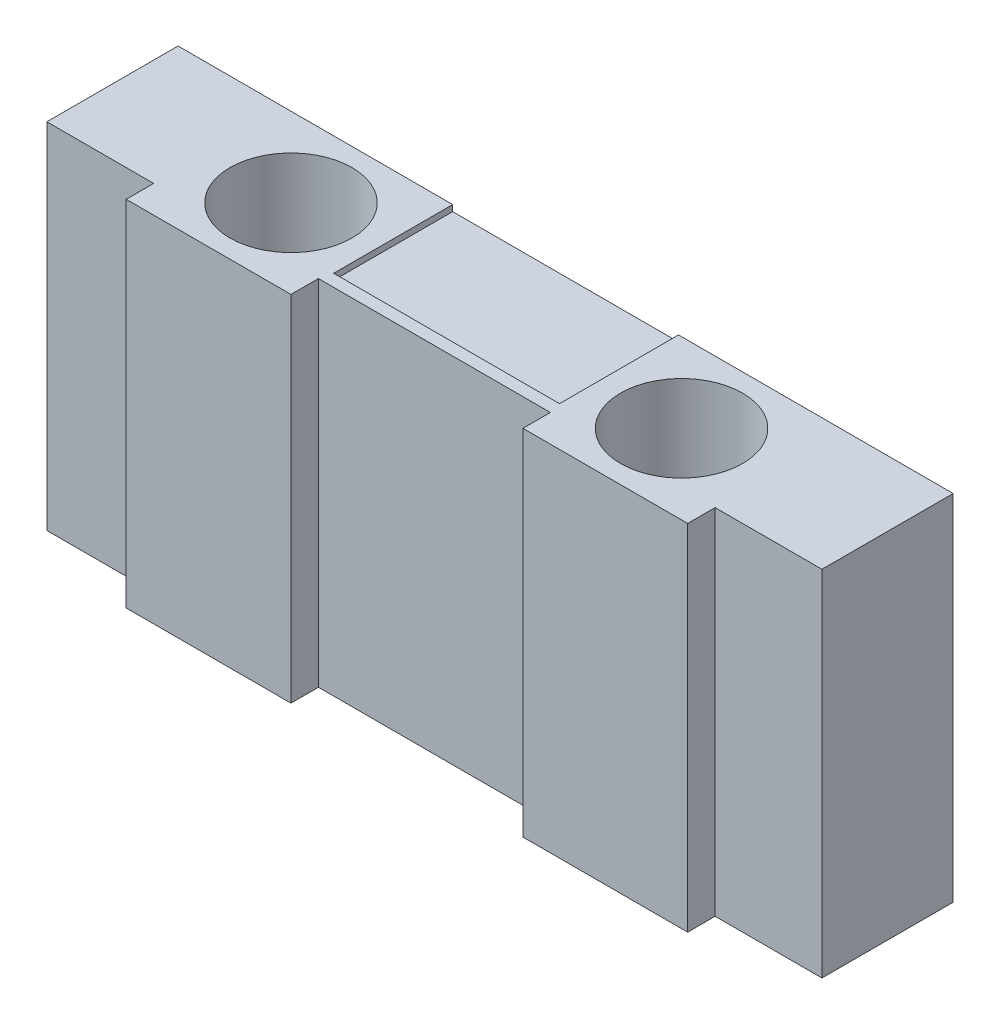
ISO-10303-21;
HEADER;
FILE_DESCRIPTION(('STEP AP214'),'2;1');
FILE_NAME('part.step','',(''),(''),'','','');
FILE_SCHEMA(('AUTOMOTIVE_DESIGN { 1 0 10303 214 1 1 1 1 }'));
ENDSEC;
DATA;
#1=APPLICATION_CONTEXT('core data for automotive mechanical design processes');
#2=APPLICATION_PROTOCOL_DEFINITION('international standard','automotive_design',2000,#1);
#3=PRODUCT_CONTEXT('',#1,'mechanical');
#4=PRODUCT('Part','Part','',(#3));
#5=PRODUCT_RELATED_PRODUCT_CATEGORY('part','',(#4));
#6=PRODUCT_DEFINITION_FORMATION('','',#4);
#7=PRODUCT_DEFINITION_CONTEXT('part definition',#1,'design');
#8=PRODUCT_DEFINITION('design','',#6,#7);
#9=PRODUCT_DEFINITION_SHAPE('','',#8);
#10=(LENGTH_UNIT() NAMED_UNIT(*) SI_UNIT(.MILLI.,.METRE.));
#11=(NAMED_UNIT(*) PLANE_ANGLE_UNIT() SI_UNIT($,.RADIAN.));
#12=(NAMED_UNIT(*) SI_UNIT($,.STERADIAN.) SOLID_ANGLE_UNIT());
#13=UNCERTAINTY_MEASURE_WITH_UNIT(LENGTH_MEASURE(1.E-05),#10,'distance_accuracy_value','');
#14=(GEOMETRIC_REPRESENTATION_CONTEXT(3) GLOBAL_UNCERTAINTY_ASSIGNED_CONTEXT((#13)) GLOBAL_UNIT_ASSIGNED_CONTEXT((#10,
#11,#12)) REPRESENTATION_CONTEXT('',''));
#15=CARTESIAN_POINT('',(0.,0.,0.));
#16=DIRECTION('',(0.,0.,1.));
#17=DIRECTION('',(1.,0.,0.));
#18=AXIS2_PLACEMENT_3D('',#15,#16,#17);
#19=CARTESIAN_POINT('',(6.35,2.9,2.6));
#20=DIRECTION('',(-1.,0.,0.));
#21=DIRECTION('',(0.,0.,1.));
#22=AXIS2_PLACEMENT_3D('',#19,#20,#21);
#23=PLANE('',#22);
#24=DIRECTION('',(0.,1.,0.));
#25=VECTOR('',#24,1.);
#26=CARTESIAN_POINT('',(6.35,2.9,2.15));
#27=LINE('',#26,#25);
#28=CARTESIAN_POINT('',(6.35,-2.9,2.15));
#29=VERTEX_POINT('',#28);
#30=CARTESIAN_POINT('',(6.35,2.9,2.15));
#31=VERTEX_POINT('',#30);
#32=EDGE_CURVE('E171',#29,#31,#27,.T.);
#33=ORIENTED_EDGE('',*,*,#32,.F.);
#34=DIRECTION('',(0.,0.,-1.));
#35=VECTOR('',#34,1.);
#36=CARTESIAN_POINT('',(6.35,-2.9,2.6));
#37=LINE('',#36,#35);
#38=CARTESIAN_POINT('',(6.35,-2.9,0.));
#39=VERTEX_POINT('',#38);
#40=EDGE_CURVE('E195',#29,#39,#37,.T.);
#41=ORIENTED_EDGE('',*,*,#40,.T.);
#42=DIRECTION('',(0.,1.,0.));
#43=VECTOR('',#42,1.);
#44=CARTESIAN_POINT('',(6.35,2.9,0.));
#45=LINE('',#44,#43);
#46=CARTESIAN_POINT('',(6.35,2.9,0.));
#47=VERTEX_POINT('',#46);
#48=EDGE_CURVE('E193',#39,#47,#45,.T.);
#49=ORIENTED_EDGE('',*,*,#48,.T.);
#50=DIRECTION('',(0.,0.,-1.));
#51=VECTOR('',#50,1.);
#52=CARTESIAN_POINT('',(6.35,2.9,2.6));
#53=LINE('',#52,#51);
#54=EDGE_CURVE('E188',#31,#47,#53,.T.);
#55=ORIENTED_EDGE('',*,*,#54,.F.);
#56=EDGE_LOOP('',(#33,#41,#49,#55));
#57=FACE_BOUND('',#56,.T.);
#58=ADVANCED_FACE('F33',(#57),#23,.F.);
#59=CARTESIAN_POINT('',(0.,0.,2.6));
#60=DIRECTION('',(0.,0.,1.));
#61=DIRECTION('',(1.,0.,0.));
#62=AXIS2_PLACEMENT_3D('',#59,#60,#61);
#63=PLANE('',#62);
#64=DIRECTION('',(0.,1.,0.));
#65=VECTOR('',#64,1.);
#66=CARTESIAN_POINT('',(-4.6,2.9,2.6));
#67=LINE('',#66,#65);
#68=CARTESIAN_POINT('',(-4.6,-2.9,2.6));
#69=VERTEX_POINT('',#68);
#70=CARTESIAN_POINT('',(-4.6,2.9,2.6));
#71=VERTEX_POINT('',#70);
#72=EDGE_CURVE('E333',#69,#71,#67,.T.);
#73=ORIENTED_EDGE('',*,*,#72,.F.);
#74=DIRECTION('',(1.,0.,0.));
#75=VECTOR('',#74,1.);
#76=CARTESIAN_POINT('',(-1.85,-2.9,2.6));
#77=LINE('',#76,#75);
#78=CARTESIAN_POINT('',(-1.9,-2.9,2.6));
#79=VERTEX_POINT('',#78);
#80=EDGE_CURVE('E295',#69,#79,#77,.T.);
#81=ORIENTED_EDGE('',*,*,#80,.T.);
#82=DIRECTION('',(0.,-1.,0.));
#83=VECTOR('',#82,1.);
#84=CARTESIAN_POINT('',(-1.9,-2.9,2.6));
#85=LINE('',#84,#83);
#86=CARTESIAN_POINT('',(-1.9,2.9,2.6));
#87=VERTEX_POINT('',#86);
#88=EDGE_CURVE('E315',#87,#79,#85,.T.);
#89=ORIENTED_EDGE('',*,*,#88,.F.);
#90=DIRECTION('',(-1.,0.,0.));
#91=VECTOR('',#90,1.);
#92=CARTESIAN_POINT('',(6.35,2.9,2.6));
#93=LINE('',#92,#91);
#94=EDGE_CURVE('E294',#87,#71,#93,.T.);
#95=ORIENTED_EDGE('',*,*,#94,.T.);
#96=EDGE_LOOP('',(#73,#81,#89,#95));
#97=FACE_BOUND('',#96,.T.);
#98=ADVANCED_FACE('F376',(#97),#63,.T.);
#99=CARTESIAN_POINT('',(-1.85,-2.9,2.6));
#100=DIRECTION('',(-1.,0.,0.));
#101=DIRECTION('',(0.,0.,1.));
#102=AXIS2_PLACEMENT_3D('',#99,#100,#101);
#103=PLANE('',#102);
#104=DIRECTION('',(0.,0.,-1.));
#105=VECTOR('',#104,1.);
#106=CARTESIAN_POINT('',(-1.85,-2.8,2.6));
#107=LINE('',#106,#105);
#108=CARTESIAN_POINT('',(-1.85,-2.8,1.85));
#109=VERTEX_POINT('',#108);
#110=CARTESIAN_POINT('',(-1.85,-2.8,0.));
#111=VERTEX_POINT('',#110);
#112=EDGE_CURVE('E207',#109,#111,#107,.T.);
#113=ORIENTED_EDGE('',*,*,#112,.F.);
#114=DIRECTION('',(0.,-0.707106781186544,0.707106781186552));
#115=VECTOR('',#114,1.);
#116=CARTESIAN_POINT('',(-1.85,-3.225,2.27500000000001));
#117=LINE('',#116,#115);
#118=CARTESIAN_POINT('',(-1.85,-2.9,1.95));
#119=VERTEX_POINT('',#118);
#120=EDGE_CURVE('E232',#109,#119,#117,.T.);
#121=ORIENTED_EDGE('',*,*,#120,.T.);
#122=DIRECTION('',(0.,0.,-1.));
#123=VECTOR('',#122,1.);
#124=CARTESIAN_POINT('',(-1.85,-2.9,2.6));
#125=LINE('',#124,#123);
#126=CARTESIAN_POINT('',(-1.85,-2.9,0.));
#127=VERTEX_POINT('',#126);
#128=EDGE_CURVE('E209',#119,#127,#125,.T.);
#129=ORIENTED_EDGE('',*,*,#128,.T.);
#130=DIRECTION('',(0.,1.,0.));
#131=VECTOR('',#130,1.);
#132=CARTESIAN_POINT('',(-1.85,-2.9,0.));
#133=LINE('',#132,#131);
#134=EDGE_CURVE('E287',#127,#111,#133,.T.);
#135=ORIENTED_EDGE('',*,*,#134,.T.);
#136=EDGE_LOOP('',(#113,#121,#129,#135));
#137=FACE_BOUND('',#136,.T.);
#138=ADVANCED_FACE('F407',(#137),#103,.F.);
#139=CARTESIAN_POINT('',(-1.85,-2.8,2.6));
#140=DIRECTION('',(0.,1.,0.));
#141=DIRECTION('',(0.,0.,1.));
#142=AXIS2_PLACEMENT_3D('',#139,#140,#141);
#143=PLANE('',#142);
#144=DIRECTION('',(0.,0.,-1.));
#145=VECTOR('',#144,1.);
#146=CARTESIAN_POINT('',(1.85,-2.8,2.6));
#147=LINE('',#146,#145);
#148=CARTESIAN_POINT('',(1.85,-2.8,1.85));
#149=VERTEX_POINT('',#148);
#150=CARTESIAN_POINT('',(1.85,-2.8,0.));
#151=VERTEX_POINT('',#150);
#152=EDGE_CURVE('E205',#149,#151,#147,.T.);
#153=ORIENTED_EDGE('',*,*,#152,.F.);
#154=DIRECTION('',(-1.,0.,0.));
#155=VECTOR('',#154,1.);
#156=CARTESIAN_POINT('',(-1.85,-2.8,1.85));
#157=LINE('',#156,#155);
#158=EDGE_CURVE('E229',#149,#109,#157,.T.);
#159=ORIENTED_EDGE('',*,*,#158,.T.);
#160=ORIENTED_EDGE('',*,*,#112,.T.);
#161=DIRECTION('',(1.,0.,0.));
#162=VECTOR('',#161,1.);
#163=CARTESIAN_POINT('',(-1.85,-2.8,0.));
#164=LINE('',#163,#162);
#165=EDGE_CURVE('E284',#111,#151,#164,.T.);
#166=ORIENTED_EDGE('',*,*,#165,.T.);
#167=EDGE_LOOP('',(#153,#159,#160,#166));
#168=FACE_BOUND('',#167,.T.);
#169=ADVANCED_FACE('F418',(#168),#143,.F.);
#170=CARTESIAN_POINT('',(1.85,-2.9,2.6));
#171=DIRECTION('',(1.,0.,0.));
#172=DIRECTION('',(0.,0.,-1.));
#173=AXIS2_PLACEMENT_3D('',#170,#171,#172);
#174=PLANE('',#173);
#175=DIRECTION('',(0.,0.,-1.));
#176=VECTOR('',#175,1.);
#177=CARTESIAN_POINT('',(1.85,-2.9,2.6));
#178=LINE('',#177,#176);
#179=CARTESIAN_POINT('',(1.85,-2.9,1.95));
#180=VERTEX_POINT('',#179);
#181=CARTESIAN_POINT('',(1.85,-2.9,0.));
#182=VERTEX_POINT('',#181);
#183=EDGE_CURVE('E198',#180,#182,#178,.T.);
#184=ORIENTED_EDGE('',*,*,#183,.F.);
#185=DIRECTION('',(0.,0.707106781186544,-0.707106781186552));
#186=VECTOR('',#185,1.);
#187=CARTESIAN_POINT('',(1.85,-3.225,2.27500000000001));
#188=LINE('',#187,#186);
#189=EDGE_CURVE('E226',#180,#149,#188,.T.);
#190=ORIENTED_EDGE('',*,*,#189,.T.);
#191=ORIENTED_EDGE('',*,*,#152,.T.);
#192=DIRECTION('',(0.,-1.,0.));
#193=VECTOR('',#192,1.);
#194=CARTESIAN_POINT('',(1.85,-2.9,0.));
#195=LINE('',#194,#193);
#196=EDGE_CURVE('E281',#151,#182,#195,.T.);
#197=ORIENTED_EDGE('',*,*,#196,.T.);
#198=EDGE_LOOP('',(#184,#190,#191,#197));
#199=FACE_BOUND('',#198,.T.);
#200=ADVANCED_FACE('F414',(#199),#174,.F.);
#201=CARTESIAN_POINT('',(6.35,-2.9,2.6));
#202=DIRECTION('',(0.,1.,0.));
#203=DIRECTION('',(0.,0.,1.));
#204=AXIS2_PLACEMENT_3D('',#201,#202,#203);
#205=PLANE('',#204);
#206=CARTESIAN_POINT('',(3.2,-2.9,1.3));
#207=DIRECTION('',(0.,1.,0.));
#208=DIRECTION('',(0.,0.,1.));
#209=AXIS2_PLACEMENT_3D('',#206,#207,#208);
#210=CIRCLE('',#209,1.);
#211=CARTESIAN_POINT('',(3.2,-2.9,2.3));
#212=VERTEX_POINT('',#211);
#213=EDGE_CURVE('E216',#212,#212,#210,.T.);
#214=ORIENTED_EDGE('',*,*,#213,.T.);
#215=EDGE_LOOP('',(#214));
#216=FACE_BOUND('',#215,.T.);
#217=DIRECTION('',(1.,0.,0.));
#218=VECTOR('',#217,1.);
#219=CARTESIAN_POINT('',(4.6,-2.9,2.15));
#220=LINE('',#219,#218);
#221=CARTESIAN_POINT('',(4.6,-2.9,2.15));
#222=VERTEX_POINT('',#221);
#223=EDGE_CURVE('E177',#222,#29,#220,.T.);
#224=ORIENTED_EDGE('',*,*,#223,.F.);
#225=DIRECTION('',(0.,0.,1.));
#226=VECTOR('',#225,1.);
#227=CARTESIAN_POINT('',(4.6,-2.9,2.15));
#228=LINE('',#227,#226);
#229=CARTESIAN_POINT('',(4.6,-2.9,2.6));
#230=VERTEX_POINT('',#229);
#231=EDGE_CURVE('E336',#222,#230,#228,.T.);
#232=ORIENTED_EDGE('',*,*,#231,.T.);
#233=CARTESIAN_POINT('',(1.9,-2.9,2.6));
#234=VERTEX_POINT('',#233);
#235=EDGE_CURVE('E265',#234,#230,#77,.T.);
#236=ORIENTED_EDGE('',*,*,#235,.F.);
#237=DIRECTION('',(0.,0.,1.));
#238=VECTOR('',#237,1.);
#239=CARTESIAN_POINT('',(1.9,-2.9,2.15));
#240=LINE('',#239,#238);
#241=CARTESIAN_POINT('',(1.9,-2.9,2.15));
#242=VERTEX_POINT('',#241);
#243=EDGE_CURVE('E304',#242,#234,#240,.T.);
#244=ORIENTED_EDGE('',*,*,#243,.F.);
#245=DIRECTION('',(1.,0.,0.));
#246=VECTOR('',#245,1.);
#247=CARTESIAN_POINT('',(1.9,-2.9,2.15));
#248=LINE('',#247,#246);
#249=CARTESIAN_POINT('',(-1.9,-2.9,2.15));
#250=VERTEX_POINT('',#249);
#251=EDGE_CURVE('E324',#250,#242,#248,.T.);
#252=ORIENTED_EDGE('',*,*,#251,.F.);
#253=DIRECTION('',(0.,0.,1.));
#254=VECTOR('',#253,1.);
#255=CARTESIAN_POINT('',(-1.9,-2.9,2.15));
#256=LINE('',#255,#254);
#257=EDGE_CURVE('E301',#250,#79,#256,.T.);
#258=ORIENTED_EDGE('',*,*,#257,.T.);
#259=ORIENTED_EDGE('',*,*,#80,.F.);
#260=DIRECTION('',(0.,0.,1.));
#261=VECTOR('',#260,1.);
#262=CARTESIAN_POINT('',(-4.6,-2.9,2.15));
#263=LINE('',#262,#261);
#264=CARTESIAN_POINT('',(-4.6,-2.9,2.15));
#265=VERTEX_POINT('',#264);
#266=EDGE_CURVE('E329',#265,#69,#263,.T.);
#267=ORIENTED_EDGE('',*,*,#266,.F.);
#268=DIRECTION('',(1.,0.,0.));
#269=VECTOR('',#268,1.);
#270=CARTESIAN_POINT('',(-4.6,-2.9,2.15));
#271=LINE('',#270,#269);
#272=CARTESIAN_POINT('',(-6.35,-2.9,2.15));
#273=VERTEX_POINT('',#272);
#274=EDGE_CURVE('E340',#273,#265,#271,.T.);
#275=ORIENTED_EDGE('',*,*,#274,.F.);
#276=DIRECTION('',(0.,0.,-1.));
#277=VECTOR('',#276,1.);
#278=CARTESIAN_POINT('',(-6.35,-2.9,2.6));
#279=LINE('',#278,#277);
#280=CARTESIAN_POINT('',(-6.35,-2.9,0.));
#281=VERTEX_POINT('',#280);
#282=EDGE_CURVE('E259',#273,#281,#279,.T.);
#283=ORIENTED_EDGE('',*,*,#282,.T.);
#284=DIRECTION('',(1.,0.,0.));
#285=VECTOR('',#284,1.);
#286=CARTESIAN_POINT('',(-1.85,-2.9,0.));
#287=LINE('',#286,#285);
#288=EDGE_CURVE('E290',#281,#127,#287,.T.);
#289=ORIENTED_EDGE('',*,*,#288,.T.);
#290=ORIENTED_EDGE('',*,*,#128,.F.);
#291=DIRECTION('',(1.,0.,0.));
#292=VECTOR('',#291,1.);
#293=CARTESIAN_POINT('',(1.85,-2.9,1.95));
#294=LINE('',#293,#292);
#295=EDGE_CURVE('E211',#119,#180,#294,.T.);
#296=ORIENTED_EDGE('',*,*,#295,.T.);
#297=ORIENTED_EDGE('',*,*,#183,.T.);
#298=DIRECTION('',(1.,0.,0.));
#299=VECTOR('',#298,1.);
#300=CARTESIAN_POINT('',(6.35,-2.9,0.));
#301=LINE('',#300,#299);
#302=EDGE_CURVE('E278',#182,#39,#301,.T.);
#303=ORIENTED_EDGE('',*,*,#302,.T.);
#304=ORIENTED_EDGE('',*,*,#40,.F.);
#305=EDGE_LOOP('',(#224,#232,#236,#244,#252,#258,#259,#267,#275,#283,#289,#290,#296,#297,#303,#304));
#306=FACE_BOUND('',#305,.T.);
#307=CARTESIAN_POINT('',(-3.2,-2.9,1.3));
#308=DIRECTION('',(0.,1.,0.));
#309=DIRECTION('',(0.,0.,1.));
#310=AXIS2_PLACEMENT_3D('',#307,#308,#309);
#311=CIRCLE('',#310,1.);
#312=CARTESIAN_POINT('',(-3.2,-2.9,2.3));
#313=VERTEX_POINT('',#312);
#314=EDGE_CURVE('E215',#313,#313,#311,.T.);
#315=ORIENTED_EDGE('',*,*,#314,.T.);
#316=EDGE_LOOP('',(#315));
#317=FACE_BOUND('',#316,.T.);
#318=ADVANCED_FACE('F350',(#216,#306,#317),#205,.F.);
#319=CARTESIAN_POINT('',(1.85,2.8,2.6));
#320=DIRECTION('',(1.,0.,0.));
#321=DIRECTION('',(0.,0.,-1.));
#322=AXIS2_PLACEMENT_3D('',#319,#320,#321);
#323=PLANE('',#322);
#324=DIRECTION('',(0.,0.,-1.));
#325=VECTOR('',#324,1.);
#326=CARTESIAN_POINT('',(1.85,2.8,2.6));
#327=LINE('',#326,#325);
#328=CARTESIAN_POINT('',(1.85,2.8,1.85));
#329=VERTEX_POINT('',#328);
#330=CARTESIAN_POINT('',(1.85,2.8,0.));
#331=VERTEX_POINT('',#330);
#332=EDGE_CURVE('E200',#329,#331,#327,.T.);
#333=ORIENTED_EDGE('',*,*,#332,.F.);
#334=DIRECTION('',(0.,0.707106781186544,0.707106781186552));
#335=VECTOR('',#334,1.);
#336=CARTESIAN_POINT('',(1.85,3.175,2.22500000000001));
#337=LINE('',#336,#335);
#338=CARTESIAN_POINT('',(1.85,2.9,1.95));
#339=VERTEX_POINT('',#338);
#340=EDGE_CURVE('E11',#329,#339,#337,.T.);
#341=ORIENTED_EDGE('',*,*,#340,.T.);
#342=DIRECTION('',(0.,0.,-1.));
#343=VECTOR('',#342,1.);
#344=CARTESIAN_POINT('',(1.85,2.9,2.6));
#345=LINE('',#344,#343);
#346=CARTESIAN_POINT('',(1.85,2.9,0.));
#347=VERTEX_POINT('',#346);
#348=EDGE_CURVE('E196',#339,#347,#345,.T.);
#349=ORIENTED_EDGE('',*,*,#348,.T.);
#350=DIRECTION('',(0.,-1.,0.));
#351=VECTOR('',#350,1.);
#352=CARTESIAN_POINT('',(1.85,2.8,0.));
#353=LINE('',#352,#351);
#354=EDGE_CURVE('E251',#347,#331,#353,.T.);
#355=ORIENTED_EDGE('',*,*,#354,.T.);
#356=EDGE_LOOP('',(#333,#341,#349,#355));
#357=FACE_BOUND('',#356,.T.);
#358=ADVANCED_FACE('F249',(#357),#323,.F.);
#359=CARTESIAN_POINT('',(-1.85,2.8,2.6));
#360=DIRECTION('',(0.,-1.,0.));
#361=DIRECTION('',(0.,0.,-1.));
#362=AXIS2_PLACEMENT_3D('',#359,#360,#361);
#363=PLANE('',#362);
#364=DIRECTION('',(0.,0.,-1.));
#365=VECTOR('',#364,1.);
#366=CARTESIAN_POINT('',(-1.85,2.8,2.6));
#367=LINE('',#366,#365);
#368=CARTESIAN_POINT('',(-1.85,2.8,1.85));
#369=VERTEX_POINT('',#368);
#370=CARTESIAN_POINT('',(-1.85,2.8,0.));
#371=VERTEX_POINT('',#370);
#372=EDGE_CURVE('E244',#369,#371,#367,.T.);
#373=ORIENTED_EDGE('',*,*,#372,.F.);
#374=DIRECTION('',(1.,0.,0.));
#375=VECTOR('',#374,1.);
#376=CARTESIAN_POINT('',(-1.85,2.8,1.85));
#377=LINE('',#376,#375);
#378=EDGE_CURVE('E41',#369,#329,#377,.T.);
#379=ORIENTED_EDGE('',*,*,#378,.T.);
#380=ORIENTED_EDGE('',*,*,#332,.T.);
#381=DIRECTION('',(-1.,0.,0.));
#382=VECTOR('',#381,1.);
#383=CARTESIAN_POINT('',(-1.85,2.8,0.));
#384=LINE('',#383,#382);
#385=EDGE_CURVE('E272',#331,#371,#384,.T.);
#386=ORIENTED_EDGE('',*,*,#385,.T.);
#387=EDGE_LOOP('',(#373,#379,#380,#386));
#388=FACE_BOUND('',#387,.T.);
#389=ADVANCED_FACE('F241',(#388),#363,.F.);
#390=CARTESIAN_POINT('',(-1.85,2.8,2.6));
#391=DIRECTION('',(-1.,0.,0.));
#392=DIRECTION('',(0.,0.,1.));
#393=AXIS2_PLACEMENT_3D('',#390,#391,#392);
#394=PLANE('',#393);
#395=DIRECTION('',(0.,0.,-1.));
#396=VECTOR('',#395,1.);
#397=CARTESIAN_POINT('',(-1.85,2.9,2.6));
#398=LINE('',#397,#396);
#399=CARTESIAN_POINT('',(-1.85,2.9,1.95));
#400=VERTEX_POINT('',#399);
#401=CARTESIAN_POINT('',(-1.85,2.9,0.));
#402=VERTEX_POINT('',#401);
#403=EDGE_CURVE('E253',#400,#402,#398,.T.);
#404=ORIENTED_EDGE('',*,*,#403,.F.);
#405=DIRECTION('',(0.,-0.707106781186544,-0.707106781186552));
#406=VECTOR('',#405,1.);
#407=CARTESIAN_POINT('',(-1.85,3.175,2.22500000000001));
#408=LINE('',#407,#406);
#409=EDGE_CURVE('E235',#400,#369,#408,.T.);
#410=ORIENTED_EDGE('',*,*,#409,.T.);
#411=ORIENTED_EDGE('',*,*,#372,.T.);
#412=DIRECTION('',(0.,1.,0.));
#413=VECTOR('',#412,1.);
#414=CARTESIAN_POINT('',(-1.85,2.8,0.));
#415=LINE('',#414,#413);
#416=EDGE_CURVE('E269',#371,#402,#415,.T.);
#417=ORIENTED_EDGE('',*,*,#416,.T.);
#418=EDGE_LOOP('',(#404,#410,#411,#417));
#419=FACE_BOUND('',#418,.T.);
#420=ADVANCED_FACE('F364',(#419),#394,.F.);
#421=CARTESIAN_POINT('',(-1.85,2.9,2.6));
#422=DIRECTION('',(0.,-1.,0.));
#423=DIRECTION('',(0.,0.,-1.));
#424=AXIS2_PLACEMENT_3D('',#421,#422,#423);
#425=PLANE('',#424);
#426=CARTESIAN_POINT('',(4.6,2.9,2.6));
#427=VERTEX_POINT('',#426);
#428=CARTESIAN_POINT('',(1.9,2.9,2.6));
#429=VERTEX_POINT('',#428);
#430=EDGE_CURVE('E261',#427,#429,#93,.T.);
#431=ORIENTED_EDGE('',*,*,#430,.F.);
#432=DIRECTION('',(0.,0.,1.));
#433=VECTOR('',#432,1.);
#434=CARTESIAN_POINT('',(4.6,2.9,2.15));
#435=LINE('',#434,#433);
#436=CARTESIAN_POINT('',(4.6,2.9,2.15));
#437=VERTEX_POINT('',#436);
#438=EDGE_CURVE('E48',#437,#427,#435,.T.);
#439=ORIENTED_EDGE('',*,*,#438,.F.);
#440=DIRECTION('',(-1.,0.,0.));
#441=VECTOR('',#440,1.);
#442=CARTESIAN_POINT('',(4.6,2.9,2.15));
#443=LINE('',#442,#441);
#444=EDGE_CURVE('E175',#31,#437,#443,.T.);
#445=ORIENTED_EDGE('',*,*,#444,.F.);
#446=ORIENTED_EDGE('',*,*,#54,.T.);
#447=DIRECTION('',(-1.,0.,0.));
#448=VECTOR('',#447,1.);
#449=CARTESIAN_POINT('',(6.35,2.9,0.));
#450=LINE('',#449,#448);
#451=EDGE_CURVE('E275',#47,#347,#450,.T.);
#452=ORIENTED_EDGE('',*,*,#451,.T.);
#453=ORIENTED_EDGE('',*,*,#348,.F.);
#454=DIRECTION('',(-1.,0.,0.));
#455=VECTOR('',#454,1.);
#456=CARTESIAN_POINT('',(-1.85,2.9,1.95));
#457=LINE('',#456,#455);
#458=EDGE_CURVE('E223',#339,#400,#457,.T.);
#459=ORIENTED_EDGE('',*,*,#458,.T.);
#460=ORIENTED_EDGE('',*,*,#403,.T.);
#461=DIRECTION('',(-1.,0.,0.));
#462=VECTOR('',#461,1.);
#463=CARTESIAN_POINT('',(-1.85,2.9,0.));
#464=LINE('',#463,#462);
#465=CARTESIAN_POINT('',(-6.35,2.9,0.));
#466=VERTEX_POINT('',#465);
#467=EDGE_CURVE('E266',#402,#466,#464,.T.);
#468=ORIENTED_EDGE('',*,*,#467,.T.);
#469=DIRECTION('',(0.,0.,-1.));
#470=VECTOR('',#469,1.);
#471=CARTESIAN_POINT('',(-6.35,2.9,2.6));
#472=LINE('',#471,#470);
#473=CARTESIAN_POINT('',(-6.35,2.9,2.15));
#474=VERTEX_POINT('',#473);
#475=EDGE_CURVE('E257',#474,#466,#472,.T.);
#476=ORIENTED_EDGE('',*,*,#475,.F.);
#477=DIRECTION('',(-1.,0.,0.));
#478=VECTOR('',#477,1.);
#479=CARTESIAN_POINT('',(-4.6,2.9,2.15));
#480=LINE('',#479,#478);
#481=CARTESIAN_POINT('',(-4.6,2.9,2.15));
#482=VERTEX_POINT('',#481);
#483=EDGE_CURVE('E56',#482,#474,#480,.T.);
#484=ORIENTED_EDGE('',*,*,#483,.F.);
#485=DIRECTION('',(0.,0.,1.));
#486=VECTOR('',#485,1.);
#487=CARTESIAN_POINT('',(-4.6,2.9,2.15));
#488=LINE('',#487,#486);
#489=EDGE_CURVE('E318',#482,#71,#488,.T.);
#490=ORIENTED_EDGE('',*,*,#489,.T.);
#491=ORIENTED_EDGE('',*,*,#94,.F.);
#492=DIRECTION('',(0.,0.,1.));
#493=VECTOR('',#492,1.);
#494=CARTESIAN_POINT('',(-1.9,2.9,2.15));
#495=LINE('',#494,#493);
#496=CARTESIAN_POINT('',(-1.9,2.9,2.15));
#497=VERTEX_POINT('',#496);
#498=EDGE_CURVE('E220',#497,#87,#495,.T.);
#499=ORIENTED_EDGE('',*,*,#498,.F.);
#500=DIRECTION('',(-1.,0.,0.));
#501=VECTOR('',#500,1.);
#502=CARTESIAN_POINT('',(1.9,2.9,2.15));
#503=LINE('',#502,#501);
#504=CARTESIAN_POINT('',(1.9,2.9,2.15));
#505=VERTEX_POINT('',#504);
#506=EDGE_CURVE('E305',#505,#497,#503,.T.);
#507=ORIENTED_EDGE('',*,*,#506,.F.);
#508=DIRECTION('',(0.,0.,1.));
#509=VECTOR('',#508,1.);
#510=CARTESIAN_POINT('',(1.9,2.9,2.15));
#511=LINE('',#510,#509);
#512=EDGE_CURVE('E307',#505,#429,#511,.T.);
#513=ORIENTED_EDGE('',*,*,#512,.T.);
#514=EDGE_LOOP('',(#431,#439,#445,#446,#452,#453,#459,#460,#468,#476,#484,#490,#491,#499,#507,#513));
#515=FACE_BOUND('',#514,.T.);
#516=CARTESIAN_POINT('',(-3.2,2.9,1.3));
#517=DIRECTION('',(0.,-1.,0.));
#518=DIRECTION('',(0.,0.,-1.));
#519=AXIS2_PLACEMENT_3D('',#516,#517,#518);
#520=CIRCLE('',#519,1.);
#521=CARTESIAN_POINT('',(-3.2,2.9,0.3));
#522=VERTEX_POINT('',#521);
#523=EDGE_CURVE('E212',#522,#522,#520,.T.);
#524=ORIENTED_EDGE('',*,*,#523,.T.);
#525=EDGE_LOOP('',(#524));
#526=FACE_BOUND('',#525,.T.);
#527=CARTESIAN_POINT('',(3.2,2.9,1.3));
#528=DIRECTION('',(0.,-1.,0.));
#529=DIRECTION('',(0.,0.,-1.));
#530=AXIS2_PLACEMENT_3D('',#527,#528,#529);
#531=CIRCLE('',#530,1.);
#532=CARTESIAN_POINT('',(3.2,2.9,0.300000000000001));
#533=VERTEX_POINT('',#532);
#534=EDGE_CURVE('E217',#533,#533,#531,.T.);
#535=ORIENTED_EDGE('',*,*,#534,.T.);
#536=EDGE_LOOP('',(#535));
#537=FACE_BOUND('',#536,.T.);
#538=ADVANCED_FACE('F185',(#515,#526,#537),#425,.F.);
#539=CARTESIAN_POINT('',(-6.35,2.9,2.6));
#540=DIRECTION('',(1.,0.,0.));
#541=DIRECTION('',(0.,0.,-1.));
#542=AXIS2_PLACEMENT_3D('',#539,#540,#541);
#543=PLANE('',#542);
#544=ORIENTED_EDGE('',*,*,#282,.F.);
#545=DIRECTION('',(0.,-1.,0.));
#546=VECTOR('',#545,1.);
#547=CARTESIAN_POINT('',(-6.35,2.9,2.15));
#548=LINE('',#547,#546);
#549=EDGE_CURVE('E335',#474,#273,#548,.T.);
#550=ORIENTED_EDGE('',*,*,#549,.F.);
#551=ORIENTED_EDGE('',*,*,#475,.T.);
#552=DIRECTION('',(0.,-1.,0.));
#553=VECTOR('',#552,1.);
#554=CARTESIAN_POINT('',(-6.35,2.9,0.));
#555=LINE('',#554,#553);
#556=EDGE_CURVE('E262',#466,#281,#555,.T.);
#557=ORIENTED_EDGE('',*,*,#556,.T.);
#558=EDGE_LOOP('',(#544,#550,#551,#557));
#559=FACE_BOUND('',#558,.T.);
#560=ADVANCED_FACE('F368',(#559),#543,.F.);
#561=DIRECTION('',(0.,-1.,0.));
#562=VECTOR('',#561,1.);
#563=CARTESIAN_POINT('',(4.6,2.9,2.6));
#564=LINE('',#563,#562);
#565=EDGE_CURVE('E181',#427,#230,#564,.T.);
#566=ORIENTED_EDGE('',*,*,#565,.F.);
#567=ORIENTED_EDGE('',*,*,#430,.T.);
#568=DIRECTION('',(0.,1.,0.));
#569=VECTOR('',#568,1.);
#570=CARTESIAN_POINT('',(1.9,-2.9,2.6));
#571=LINE('',#570,#569);
#572=EDGE_CURVE('E311',#234,#429,#571,.T.);
#573=ORIENTED_EDGE('',*,*,#572,.F.);
#574=ORIENTED_EDGE('',*,*,#235,.T.);
#575=EDGE_LOOP('',(#566,#567,#573,#574));
#576=FACE_BOUND('',#575,.T.);
#577=ADVANCED_FACE('F390',(#576),#63,.T.);
#578=CARTESIAN_POINT('',(0.,0.,0.));
#579=DIRECTION('',(0.,0.,1.));
#580=DIRECTION('',(1.,0.,0.));
#581=AXIS2_PLACEMENT_3D('',#578,#579,#580);
#582=PLANE('',#581);
#583=ORIENTED_EDGE('',*,*,#288,.F.);
#584=ORIENTED_EDGE('',*,*,#556,.F.);
#585=ORIENTED_EDGE('',*,*,#467,.F.);
#586=ORIENTED_EDGE('',*,*,#416,.F.);
#587=ORIENTED_EDGE('',*,*,#385,.F.);
#588=ORIENTED_EDGE('',*,*,#354,.F.);
#589=ORIENTED_EDGE('',*,*,#451,.F.);
#590=ORIENTED_EDGE('',*,*,#48,.F.);
#591=ORIENTED_EDGE('',*,*,#302,.F.);
#592=ORIENTED_EDGE('',*,*,#196,.F.);
#593=ORIENTED_EDGE('',*,*,#165,.F.);
#594=ORIENTED_EDGE('',*,*,#134,.F.);
#595=EDGE_LOOP('',(#583,#584,#585,#586,#587,#588,#589,#590,#591,#592,#593,#594));
#596=FACE_BOUND('',#595,.T.);
#597=ADVANCED_FACE('F358',(#596),#582,.F.);
#598=CARTESIAN_POINT('',(-3.2,-3.,1.3));
#599=DIRECTION('',(0.,1.,0.));
#600=DIRECTION('',(0.,0.,1.));
#601=AXIS2_PLACEMENT_3D('',#598,#599,#600);
#602=CYLINDRICAL_SURFACE('',#601,1.);
#603=ORIENTED_EDGE('',*,*,#523,.F.);
#604=EDGE_LOOP('',(#603));
#605=FACE_BOUND('',#604,.T.);
#606=ORIENTED_EDGE('',*,*,#314,.F.);
#607=EDGE_LOOP('',(#606));
#608=FACE_BOUND('',#607,.T.);
#609=ADVANCED_FACE('F433',(#605,#608),#602,.F.);
#610=CARTESIAN_POINT('',(3.2,-3.,1.3));
#611=DIRECTION('',(0.,1.,0.));
#612=DIRECTION('',(0.,0.,1.));
#613=AXIS2_PLACEMENT_3D('',#610,#611,#612);
#614=CYLINDRICAL_SURFACE('',#613,1.);
#615=ORIENTED_EDGE('',*,*,#534,.F.);
#616=EDGE_LOOP('',(#615));
#617=FACE_BOUND('',#616,.T.);
#618=ORIENTED_EDGE('',*,*,#213,.F.);
#619=EDGE_LOOP('',(#618));
#620=FACE_BOUND('',#619,.T.);
#621=ADVANCED_FACE('F427',(#617,#620),#614,.F.);
#622=CARTESIAN_POINT('',(6.35,-2.9,1.95));
#623=DIRECTION('',(0.,-0.707106781186552,-0.707106781186544));
#624=DIRECTION('',(-1.,0.,0.));
#625=AXIS2_PLACEMENT_3D('',#622,#623,#624);
#626=PLANE('',#625);
#627=ORIENTED_EDGE('',*,*,#120,.F.);
#628=ORIENTED_EDGE('',*,*,#158,.F.);
#629=ORIENTED_EDGE('',*,*,#189,.F.);
#630=ORIENTED_EDGE('',*,*,#295,.F.);
#631=EDGE_LOOP('',(#627,#628,#629,#630));
#632=FACE_BOUND('',#631,.T.);
#633=ADVANCED_FACE('F425',(#632),#626,.T.);
#634=CARTESIAN_POINT('',(-1.85,2.9,1.95));
#635=DIRECTION('',(0.,0.707106781186552,-0.707106781186544));
#636=DIRECTION('',(1.,0.,0.));
#637=AXIS2_PLACEMENT_3D('',#634,#635,#636);
#638=PLANE('',#637);
#639=ORIENTED_EDGE('',*,*,#340,.F.);
#640=ORIENTED_EDGE('',*,*,#378,.F.);
#641=ORIENTED_EDGE('',*,*,#409,.F.);
#642=ORIENTED_EDGE('',*,*,#458,.F.);
#643=EDGE_LOOP('',(#639,#640,#641,#642));
#644=FACE_BOUND('',#643,.T.);
#645=ADVANCED_FACE('F35',(#644),#638,.T.);
#646=CARTESIAN_POINT('',(-1.9,-2.9,2.15));
#647=DIRECTION('',(-1.,0.,0.));
#648=DIRECTION('',(0.,0.,1.));
#649=AXIS2_PLACEMENT_3D('',#646,#647,#648);
#650=PLANE('',#649);
#651=ORIENTED_EDGE('',*,*,#88,.T.);
#652=ORIENTED_EDGE('',*,*,#257,.F.);
#653=DIRECTION('',(0.,-1.,0.));
#654=VECTOR('',#653,1.);
#655=CARTESIAN_POINT('',(-1.9,-2.9,2.15));
#656=LINE('',#655,#654);
#657=EDGE_CURVE('E314',#497,#250,#656,.T.);
#658=ORIENTED_EDGE('',*,*,#657,.F.);
#659=ORIENTED_EDGE('',*,*,#498,.T.);
#660=EDGE_LOOP('',(#651,#652,#658,#659));
#661=FACE_BOUND('',#660,.T.);
#662=ADVANCED_FACE('F379',(#661),#650,.F.);
#663=CARTESIAN_POINT('',(1.9,-2.9,2.15));
#664=DIRECTION('',(1.,0.,0.));
#665=DIRECTION('',(0.,0.,-1.));
#666=AXIS2_PLACEMENT_3D('',#663,#664,#665);
#667=PLANE('',#666);
#668=ORIENTED_EDGE('',*,*,#572,.T.);
#669=ORIENTED_EDGE('',*,*,#512,.F.);
#670=DIRECTION('',(0.,1.,0.));
#671=VECTOR('',#670,1.);
#672=CARTESIAN_POINT('',(1.9,-2.9,2.15));
#673=LINE('',#672,#671);
#674=EDGE_CURVE('E321',#242,#505,#673,.T.);
#675=ORIENTED_EDGE('',*,*,#674,.F.);
#676=ORIENTED_EDGE('',*,*,#243,.T.);
#677=EDGE_LOOP('',(#668,#669,#675,#676));
#678=FACE_BOUND('',#677,.T.);
#679=ADVANCED_FACE('F387',(#678),#667,.F.);
#680=CARTESIAN_POINT('',(0.,0.,2.15));
#681=DIRECTION('',(0.,0.,1.));
#682=DIRECTION('',(1.,0.,0.));
#683=AXIS2_PLACEMENT_3D('',#680,#681,#682);
#684=PLANE('',#683);
#685=ORIENTED_EDGE('',*,*,#657,.T.);
#686=ORIENTED_EDGE('',*,*,#251,.T.);
#687=ORIENTED_EDGE('',*,*,#674,.T.);
#688=ORIENTED_EDGE('',*,*,#506,.T.);
#689=EDGE_LOOP('',(#685,#686,#687,#688));
#690=FACE_BOUND('',#689,.T.);
#691=ADVANCED_FACE('F384',(#690),#684,.T.);
#692=CARTESIAN_POINT('',(-4.6,2.9,2.15));
#693=DIRECTION('',(1.,0.,0.));
#694=DIRECTION('',(0.,0.,-1.));
#695=AXIS2_PLACEMENT_3D('',#692,#693,#694);
#696=PLANE('',#695);
#697=ORIENTED_EDGE('',*,*,#72,.T.);
#698=ORIENTED_EDGE('',*,*,#489,.F.);
#699=DIRECTION('',(0.,1.,0.));
#700=VECTOR('',#699,1.);
#701=CARTESIAN_POINT('',(-4.6,2.9,2.15));
#702=LINE('',#701,#700);
#703=EDGE_CURVE('E338',#265,#482,#702,.T.);
#704=ORIENTED_EDGE('',*,*,#703,.F.);
#705=ORIENTED_EDGE('',*,*,#266,.T.);
#706=EDGE_LOOP('',(#697,#698,#704,#705));
#707=FACE_BOUND('',#706,.T.);
#708=ADVANCED_FACE('F400',(#707),#696,.F.);
#709=CARTESIAN_POINT('',(0.,0.,2.15));
#710=DIRECTION('',(0.,0.,-1.));
#711=DIRECTION('',(-1.,0.,0.));
#712=AXIS2_PLACEMENT_3D('',#709,#710,#711);
#713=PLANE('',#712);
#714=ORIENTED_EDGE('',*,*,#549,.T.);
#715=ORIENTED_EDGE('',*,*,#274,.T.);
#716=ORIENTED_EDGE('',*,*,#703,.T.);
#717=ORIENTED_EDGE('',*,*,#483,.T.);
#718=EDGE_LOOP('',(#714,#715,#716,#717));
#719=FACE_BOUND('',#718,.T.);
#720=ADVANCED_FACE('F393',(#719),#713,.F.);
#721=CARTESIAN_POINT('',(4.6,2.9,2.15));
#722=DIRECTION('',(-1.,0.,0.));
#723=DIRECTION('',(0.,0.,1.));
#724=AXIS2_PLACEMENT_3D('',#721,#722,#723);
#725=PLANE('',#724);
#726=ORIENTED_EDGE('',*,*,#565,.T.);
#727=ORIENTED_EDGE('',*,*,#231,.F.);
#728=DIRECTION('',(0.,-1.,0.));
#729=VECTOR('',#728,1.);
#730=CARTESIAN_POINT('',(4.6,2.9,2.15));
#731=LINE('',#730,#729);
#732=EDGE_CURVE('E190',#437,#222,#731,.T.);
#733=ORIENTED_EDGE('',*,*,#732,.F.);
#734=ORIENTED_EDGE('',*,*,#438,.T.);
#735=EDGE_LOOP('',(#726,#727,#733,#734));
#736=FACE_BOUND('',#735,.T.);
#737=ADVANCED_FACE('F391',(#736),#725,.F.);
#738=CARTESIAN_POINT('',(0.,0.,2.15));
#739=DIRECTION('',(0.,0.,1.));
#740=DIRECTION('',(1.,0.,0.));
#741=AXIS2_PLACEMENT_3D('',#738,#739,#740);
#742=PLANE('',#741);
#743=ORIENTED_EDGE('',*,*,#32,.T.);
#744=ORIENTED_EDGE('',*,*,#444,.T.);
#745=ORIENTED_EDGE('',*,*,#732,.T.);
#746=ORIENTED_EDGE('',*,*,#223,.T.);
#747=EDGE_LOOP('',(#743,#744,#745,#746));
#748=FACE_BOUND('',#747,.T.);
#749=ADVANCED_FACE('F173',(#748),#742,.T.);
#750=CLOSED_SHELL('',(#58,#98,#138,#169,#200,#318,#358,#389,#420,#538,#560,#577,#597,#609,#621,
#633,#645,#662,#679,#691,#708,#720,#737,#749));
#751=MANIFOLD_SOLID_BREP('B2',#750);
#752=ADVANCED_BREP_SHAPE_REPRESENTATION('',(#18,#751),#14);
#753=SHAPE_DEFINITION_REPRESENTATION(#9,#752);
ENDSEC;
END-ISO-10303-21;
